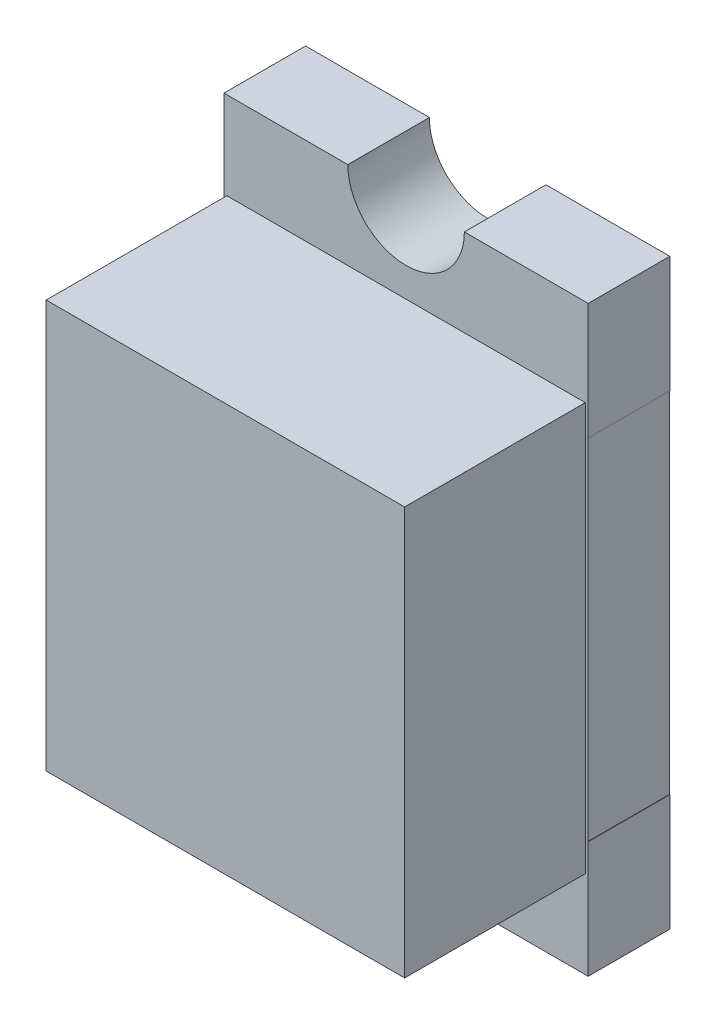
ISO-10303-21;
HEADER;
FILE_DESCRIPTION(('STEP AP214'),'2;1');
FILE_NAME('part.step','',(''),(''),'','','');
FILE_SCHEMA(('AUTOMOTIVE_DESIGN { 1 0 10303 214 1 1 1 1 }'));
ENDSEC;
DATA;
#1=APPLICATION_CONTEXT('core data for automotive mechanical design processes');
#2=APPLICATION_PROTOCOL_DEFINITION('international standard','automotive_design',2000,#1);
#3=PRODUCT_CONTEXT('',#1,'mechanical');
#4=PRODUCT('Part','Part','',(#3));
#5=PRODUCT_RELATED_PRODUCT_CATEGORY('part','',(#4));
#6=PRODUCT_DEFINITION_FORMATION('','',#4);
#7=PRODUCT_DEFINITION_CONTEXT('part definition',#1,'design');
#8=PRODUCT_DEFINITION('design','',#6,#7);
#9=PRODUCT_DEFINITION_SHAPE('','',#8);
#10=(LENGTH_UNIT() NAMED_UNIT(*) SI_UNIT(.MILLI.,.METRE.));
#11=(NAMED_UNIT(*) PLANE_ANGLE_UNIT() SI_UNIT($,.RADIAN.));
#12=(NAMED_UNIT(*) SI_UNIT($,.STERADIAN.) SOLID_ANGLE_UNIT());
#13=UNCERTAINTY_MEASURE_WITH_UNIT(LENGTH_MEASURE(1.E-05),#10,'distance_accuracy_value','');
#14=(GEOMETRIC_REPRESENTATION_CONTEXT(3) GLOBAL_UNCERTAINTY_ASSIGNED_CONTEXT((#13)) GLOBAL_UNIT_ASSIGNED_CONTEXT((#10,
#11,#12)) REPRESENTATION_CONTEXT('',''));
#15=CARTESIAN_POINT('',(0.,0.,0.));
#16=DIRECTION('',(0.,0.,1.));
#17=DIRECTION('',(1.,0.,0.));
#18=AXIS2_PLACEMENT_3D('',#15,#16,#17);
#19=CARTESIAN_POINT('',(0.010622111727652,0.0657002527691075,0.));
#20=DIRECTION('',(0.,0.,1.));
#21=DIRECTION('',(1.,0.,0.));
#22=AXIS2_PLACEMENT_3D('',#19,#20,#21);
#23=PLANE('',#22);
#24=CARTESIAN_POINT('',(0.0106221117276523,1.06570025276911,0.));
#25=DIRECTION('',(0.,0.,1.));
#26=DIRECTION('',(1.,0.,0.));
#27=AXIS2_PLACEMENT_3D('',#24,#25,#26);
#28=CIRCLE('',#27,0.2);
#29=CARTESIAN_POINT('',(-0.189377888272348,1.06570025276911,0.));
#30=VERTEX_POINT('',#29);
#31=CARTESIAN_POINT('',(0.210622111727652,1.06570025276911,0.));
#32=VERTEX_POINT('',#31);
#33=EDGE_CURVE('E20',#30,#32,#28,.T.);
#34=ORIENTED_EDGE('',*,*,#33,.T.);
#35=DIRECTION('',(1.,0.,0.));
#36=VECTOR('',#35,1.);
#37=CARTESIAN_POINT('',(0.635622111727652,1.06570025276911,0.));
#38=LINE('',#37,#36);
#39=CARTESIAN_POINT('',(0.635622111727652,1.06570025276911,0.));
#40=VERTEX_POINT('',#39);
#41=EDGE_CURVE('E178',#32,#40,#38,.T.);
#42=ORIENTED_EDGE('',*,*,#41,.T.);
#43=DIRECTION('',(0.,-1.,0.));
#44=VECTOR('',#43,1.);
#45=CARTESIAN_POINT('',(0.635622111727652,1.06570025276911,0.));
#46=LINE('',#45,#44);
#47=CARTESIAN_POINT('',(0.635622111727652,0.665700252769107,0.));
#48=VERTEX_POINT('',#47);
#49=EDGE_CURVE('E183',#40,#48,#46,.T.);
#50=ORIENTED_EDGE('',*,*,#49,.T.);
#51=DIRECTION('',(1.,0.,0.));
#52=VECTOR('',#51,1.);
#53=CARTESIAN_POINT('',(0.010622111727652,0.665700252769107,0.));
#54=LINE('',#53,#52);
#55=CARTESIAN_POINT('',(0.634622111727652,0.665700252769107,0.));
#56=VERTEX_POINT('',#55);
#57=EDGE_CURVE('E257',#48,#56,#54,.F.);
#58=ORIENTED_EDGE('',*,*,#57,.T.);
#59=DIRECTION('',(0.,-1.,0.));
#60=VECTOR('',#59,1.);
#61=CARTESIAN_POINT('',(0.634622111727652,-0.534299747230893,0.));
#62=LINE('',#61,#60);
#63=CARTESIAN_POINT('',(0.634622111727652,-0.534299747230893,0.));
#64=VERTEX_POINT('',#63);
#65=EDGE_CURVE('E189',#56,#64,#62,.T.);
#66=ORIENTED_EDGE('',*,*,#65,.T.);
#67=DIRECTION('',(1.,0.,0.));
#68=VECTOR('',#67,1.);
#69=CARTESIAN_POINT('',(0.010622111727652,-0.534299747230893,0.));
#70=LINE('',#69,#68);
#71=CARTESIAN_POINT('',(0.635622111727652,-0.534299747230893,0.));
#72=VERTEX_POINT('',#71);
#73=EDGE_CURVE('E198',#64,#72,#70,.T.);
#74=ORIENTED_EDGE('',*,*,#73,.T.);
#75=DIRECTION('',(0.,-1.,0.));
#76=VECTOR('',#75,1.);
#77=CARTESIAN_POINT('',(0.635622111727652,1.06570025276911,0.));
#78=LINE('',#77,#76);
#79=CARTESIAN_POINT('',(0.635622111727652,-0.934299747230893,0.));
#80=VERTEX_POINT('',#79);
#81=EDGE_CURVE('E195',#72,#80,#78,.T.);
#82=ORIENTED_EDGE('',*,*,#81,.T.);
#83=DIRECTION('',(-1.,0.,0.));
#84=VECTOR('',#83,1.);
#85=CARTESIAN_POINT('',(0.635622111727652,-0.934299747230893,0.));
#86=LINE('',#85,#84);
#87=CARTESIAN_POINT('',(0.210622111727652,-0.934299747230893,0.));
#88=VERTEX_POINT('',#87);
#89=EDGE_CURVE('E202',#80,#88,#86,.T.);
#90=ORIENTED_EDGE('',*,*,#89,.T.);
#91=CARTESIAN_POINT('',(0.0106221117276525,-0.934299747230892,0.));
#92=DIRECTION('',(0.,0.,1.));
#93=DIRECTION('',(1.,0.,0.));
#94=AXIS2_PLACEMENT_3D('',#91,#92,#93);
#95=CIRCLE('',#94,0.2);
#96=CARTESIAN_POINT('',(-0.189377888272347,-0.934299747230893,0.));
#97=VERTEX_POINT('',#96);
#98=EDGE_CURVE('E211',#88,#97,#95,.T.);
#99=ORIENTED_EDGE('',*,*,#98,.T.);
#100=DIRECTION('',(-1.,0.,0.));
#101=VECTOR('',#100,1.);
#102=CARTESIAN_POINT('',(0.635622111727652,-0.934299747230893,0.));
#103=LINE('',#102,#101);
#104=CARTESIAN_POINT('',(-0.614377888272348,-0.934299747230893,0.));
#105=VERTEX_POINT('',#104);
#106=EDGE_CURVE('E208',#97,#105,#103,.T.);
#107=ORIENTED_EDGE('',*,*,#106,.T.);
#108=DIRECTION('',(0.,1.,0.));
#109=VECTOR('',#108,1.);
#110=CARTESIAN_POINT('',(-0.614377888272348,1.06570025276911,0.));
#111=LINE('',#110,#109);
#112=CARTESIAN_POINT('',(-0.614377888272348,-0.534299747230892,0.));
#113=VERTEX_POINT('',#112);
#114=EDGE_CURVE('E215',#105,#113,#111,.T.);
#115=ORIENTED_EDGE('',*,*,#114,.T.);
#116=DIRECTION('',(1.,0.,0.));
#117=VECTOR('',#116,1.);
#118=CARTESIAN_POINT('',(0.010622111727652,-0.534299747230892,0.));
#119=LINE('',#118,#117);
#120=CARTESIAN_POINT('',(-0.613377888272348,-0.534299747230892,0.));
#121=VERTEX_POINT('',#120);
#122=EDGE_CURVE('E262',#113,#121,#119,.T.);
#123=ORIENTED_EDGE('',*,*,#122,.T.);
#124=DIRECTION('',(0.,1.,0.));
#125=VECTOR('',#124,1.);
#126=CARTESIAN_POINT('',(-0.613377888272348,-0.534299747230892,0.));
#127=LINE('',#126,#125);
#128=CARTESIAN_POINT('',(-0.613377888272348,0.665700252769108,0.));
#129=VERTEX_POINT('',#128);
#130=EDGE_CURVE('E221',#121,#129,#127,.T.);
#131=ORIENTED_EDGE('',*,*,#130,.T.);
#132=DIRECTION('',(1.,0.,0.));
#133=VECTOR('',#132,1.);
#134=CARTESIAN_POINT('',(0.010622111727652,0.665700252769108,0.));
#135=LINE('',#134,#133);
#136=CARTESIAN_POINT('',(-0.614377888272348,0.665700252769108,0.));
#137=VERTEX_POINT('',#136);
#138=EDGE_CURVE('E228',#129,#137,#135,.F.);
#139=ORIENTED_EDGE('',*,*,#138,.T.);
#140=DIRECTION('',(0.,1.,0.));
#141=VECTOR('',#140,1.);
#142=CARTESIAN_POINT('',(-0.614377888272348,1.06570025276911,0.));
#143=LINE('',#142,#141);
#144=CARTESIAN_POINT('',(-0.614377888272348,1.06570025276911,0.));
#145=VERTEX_POINT('',#144);
#146=EDGE_CURVE('E156',#137,#145,#143,.T.);
#147=ORIENTED_EDGE('',*,*,#146,.T.);
#148=DIRECTION('',(1.,0.,0.));
#149=VECTOR('',#148,1.);
#150=CARTESIAN_POINT('',(0.635622111727652,1.06570025276911,0.));
#151=LINE('',#150,#149);
#152=EDGE_CURVE('E151',#145,#30,#151,.T.);
#153=ORIENTED_EDGE('',*,*,#152,.T.);
#154=EDGE_LOOP('',(#34,#42,#50,#58,#66,#74,#82,#90,#99,#107,#115,#123,#131,#139,#147,#153));
#155=FACE_BOUND('',#154,.T.);
#156=ADVANCED_FACE('F17',(#155),#23,.F.);
#157=CARTESIAN_POINT('',(0.0106221117276523,1.06570025276911,0.));
#158=DIRECTION('',(0.,0.,1.));
#159=DIRECTION('',(1.,0.,0.));
#160=AXIS2_PLACEMENT_3D('',#157,#158,#159);
#161=CYLINDRICAL_SURFACE('',#160,0.2);
#162=ORIENTED_EDGE('',*,*,#33,.F.);
#163=DIRECTION('',(0.,0.,1.));
#164=VECTOR('',#163,1.);
#165=CARTESIAN_POINT('',(-0.189377888272348,1.06570025276911,0.9));
#166=LINE('',#165,#164);
#167=CARTESIAN_POINT('',(-0.189377888272348,1.06570025276911,0.28));
#168=VERTEX_POINT('',#167);
#169=EDGE_CURVE('E160',#30,#168,#166,.T.);
#170=ORIENTED_EDGE('',*,*,#169,.T.);
#171=CARTESIAN_POINT('',(0.0106221117276523,1.06570025276911,0.28));
#172=DIRECTION('',(0.,0.,1.));
#173=DIRECTION('',(1.,0.,0.));
#174=AXIS2_PLACEMENT_3D('',#171,#172,#173);
#175=CIRCLE('',#174,0.2);
#176=CARTESIAN_POINT('',(0.210622111727652,1.06570025276911,0.28));
#177=VERTEX_POINT('',#176);
#178=EDGE_CURVE('E180',#177,#168,#175,.F.);
#179=ORIENTED_EDGE('',*,*,#178,.F.);
#180=DIRECTION('',(0.,0.,1.));
#181=VECTOR('',#180,1.);
#182=CARTESIAN_POINT('',(0.210622111727652,1.06570025276911,0.9));
#183=LINE('',#182,#181);
#184=EDGE_CURVE('E166',#177,#32,#183,.F.);
#185=ORIENTED_EDGE('',*,*,#184,.T.);
#186=EDGE_LOOP('',(#162,#170,#179,#185));
#187=FACE_BOUND('',#186,.T.);
#188=ADVANCED_FACE('F163',(#187),#161,.F.);
#189=CARTESIAN_POINT('',(0.635622111727652,1.06570025276911,0.9));
#190=DIRECTION('',(0.,-1.,0.));
#191=DIRECTION('',(1.,0.,0.));
#192=AXIS2_PLACEMENT_3D('',#189,#190,#191);
#193=PLANE('',#192);
#194=ORIENTED_EDGE('',*,*,#169,.F.);
#195=ORIENTED_EDGE('',*,*,#152,.F.);
#196=DIRECTION('',(0.,0.,1.));
#197=VECTOR('',#196,1.);
#198=CARTESIAN_POINT('',(-0.614377888272348,1.06570025276911,0.9));
#199=LINE('',#198,#197);
#200=CARTESIAN_POINT('',(-0.614377888272348,1.06570025276911,0.28));
#201=VERTEX_POINT('',#200);
#202=EDGE_CURVE('E172',#145,#201,#199,.T.);
#203=ORIENTED_EDGE('',*,*,#202,.T.);
#204=DIRECTION('',(1.,0.,0.));
#205=VECTOR('',#204,1.);
#206=CARTESIAN_POINT('',(0.010622111727652,1.06570025276911,0.28));
#207=LINE('',#206,#205);
#208=EDGE_CURVE('E170',#168,#201,#207,.F.);
#209=ORIENTED_EDGE('',*,*,#208,.F.);
#210=EDGE_LOOP('',(#194,#195,#203,#209));
#211=FACE_BOUND('',#210,.T.);
#212=ADVANCED_FACE('F168',(#211),#193,.F.);
#213=CARTESIAN_POINT('',(-0.614377888272348,1.06570025276911,0.9));
#214=DIRECTION('',(1.,0.,0.));
#215=DIRECTION('',(0.,1.,0.));
#216=AXIS2_PLACEMENT_3D('',#213,#214,#215);
#217=PLANE('',#216);
#218=DIRECTION('',(0.,0.,1.));
#219=VECTOR('',#218,1.);
#220=CARTESIAN_POINT('',(-0.614377888272348,0.665700252769108,1.480000416667));
#221=LINE('',#220,#219);
#222=CARTESIAN_POINT('',(-0.614377888272348,0.665700252769108,0.28));
#223=VERTEX_POINT('',#222);
#224=EDGE_CURVE('E224',#137,#223,#221,.T.);
#225=ORIENTED_EDGE('',*,*,#224,.T.);
#226=DIRECTION('',(0.,1.,0.));
#227=VECTOR('',#226,1.);
#228=CARTESIAN_POINT('',(-0.614377888272348,0.0657002527691075,0.28));
#229=LINE('',#228,#227);
#230=EDGE_CURVE('E255',#201,#223,#229,.F.);
#231=ORIENTED_EDGE('',*,*,#230,.F.);
#232=ORIENTED_EDGE('',*,*,#202,.F.);
#233=ORIENTED_EDGE('',*,*,#146,.F.);
#234=EDGE_LOOP('',(#225,#231,#232,#233));
#235=FACE_BOUND('',#234,.T.);
#236=ADVANCED_FACE('F565',(#235),#217,.F.);
#237=CARTESIAN_POINT('',(-0.613377888272348,0.665700252769108,1.480000416667));
#238=DIRECTION('',(0.,1.,0.));
#239=DIRECTION('',(-1.,0.,0.));
#240=AXIS2_PLACEMENT_3D('',#237,#238,#239);
#241=PLANE('',#240);
#242=ORIENTED_EDGE('',*,*,#138,.F.);
#243=DIRECTION('',(0.,0.,1.));
#244=VECTOR('',#243,1.);
#245=CARTESIAN_POINT('',(-0.613377888272348,0.665700252769108,1.480000416667));
#246=LINE('',#245,#244);
#247=CARTESIAN_POINT('',(-0.613377888272348,0.665700252769108,0.28));
#248=VERTEX_POINT('',#247);
#249=EDGE_CURVE('E223',#129,#248,#246,.T.);
#250=ORIENTED_EDGE('',*,*,#249,.T.);
#251=DIRECTION('',(1.,0.,0.));
#252=VECTOR('',#251,1.);
#253=CARTESIAN_POINT('',(0.010622111727652,0.665700252769108,0.28));
#254=LINE('',#253,#252);
#255=EDGE_CURVE('E252',#223,#248,#254,.T.);
#256=ORIENTED_EDGE('',*,*,#255,.F.);
#257=ORIENTED_EDGE('',*,*,#224,.F.);
#258=EDGE_LOOP('',(#242,#250,#256,#257));
#259=FACE_BOUND('',#258,.T.);
#260=ADVANCED_FACE('F431',(#259),#241,.F.);
#261=CARTESIAN_POINT('',(-0.613377888272348,-0.534299747230892,1.480000416667));
#262=DIRECTION('',(1.,0.,0.));
#263=DIRECTION('',(0.,1.,0.));
#264=AXIS2_PLACEMENT_3D('',#261,#262,#263);
#265=PLANE('',#264);
#266=ORIENTED_EDGE('',*,*,#130,.F.);
#267=DIRECTION('',(0.,0.,1.));
#268=VECTOR('',#267,1.);
#269=CARTESIAN_POINT('',(-0.613377888272348,-0.534299747230892,1.480000416667));
#270=LINE('',#269,#268);
#271=CARTESIAN_POINT('',(-0.613377888272348,-0.534299747230892,0.28));
#272=VERTEX_POINT('',#271);
#273=EDGE_CURVE('E218',#121,#272,#270,.T.);
#274=ORIENTED_EDGE('',*,*,#273,.T.);
#275=DIRECTION('',(0.,1.,0.));
#276=VECTOR('',#275,1.);
#277=CARTESIAN_POINT('',(-0.613377888272348,0.0657002527691075,0.28));
#278=LINE('',#277,#276);
#279=EDGE_CURVE('E251',#248,#272,#278,.F.);
#280=ORIENTED_EDGE('',*,*,#279,.F.);
#281=ORIENTED_EDGE('',*,*,#249,.F.);
#282=EDGE_LOOP('',(#266,#274,#280,#281));
#283=FACE_BOUND('',#282,.T.);
#284=ADVANCED_FACE('F424',(#283),#265,.F.);
#285=CARTESIAN_POINT('',(-0.613377888272348,-0.534299747230892,1.480000416667));
#286=DIRECTION('',(0.,-1.,0.));
#287=DIRECTION('',(1.,0.,0.));
#288=AXIS2_PLACEMENT_3D('',#285,#286,#287);
#289=PLANE('',#288);
#290=ORIENTED_EDGE('',*,*,#122,.F.);
#291=DIRECTION('',(0.,0.,1.));
#292=VECTOR('',#291,1.);
#293=CARTESIAN_POINT('',(-0.614377888272348,-0.534299747230892,0.9));
#294=LINE('',#293,#292);
#295=CARTESIAN_POINT('',(-0.614377888272348,-0.534299747230892,0.28));
#296=VERTEX_POINT('',#295);
#297=EDGE_CURVE('E217',#113,#296,#294,.T.);
#298=ORIENTED_EDGE('',*,*,#297,.T.);
#299=DIRECTION('',(1.,0.,0.));
#300=VECTOR('',#299,1.);
#301=CARTESIAN_POINT('',(0.010622111727652,-0.534299747230892,0.28));
#302=LINE('',#301,#300);
#303=EDGE_CURVE('E247',#272,#296,#302,.F.);
#304=ORIENTED_EDGE('',*,*,#303,.F.);
#305=ORIENTED_EDGE('',*,*,#273,.F.);
#306=EDGE_LOOP('',(#290,#298,#304,#305));
#307=FACE_BOUND('',#306,.T.);
#308=ADVANCED_FACE('F430',(#307),#289,.F.);
#309=CARTESIAN_POINT('',(-0.614377888272348,1.06570025276911,0.9));
#310=DIRECTION('',(1.,0.,0.));
#311=DIRECTION('',(0.,1.,0.));
#312=AXIS2_PLACEMENT_3D('',#309,#310,#311);
#313=PLANE('',#312);
#314=ORIENTED_EDGE('',*,*,#297,.F.);
#315=ORIENTED_EDGE('',*,*,#114,.F.);
#316=DIRECTION('',(0.,0.,1.));
#317=VECTOR('',#316,1.);
#318=CARTESIAN_POINT('',(-0.614377888272348,-0.934299747230893,0.9));
#319=LINE('',#318,#317);
#320=CARTESIAN_POINT('',(-0.614377888272348,-0.934299747230892,0.28));
#321=VERTEX_POINT('',#320);
#322=EDGE_CURVE('E212',#105,#321,#319,.T.);
#323=ORIENTED_EDGE('',*,*,#322,.T.);
#324=DIRECTION('',(0.,1.,0.));
#325=VECTOR('',#324,1.);
#326=CARTESIAN_POINT('',(-0.614377888272348,0.0657002527691075,0.28));
#327=LINE('',#326,#325);
#328=EDGE_CURVE('E250',#296,#321,#327,.F.);
#329=ORIENTED_EDGE('',*,*,#328,.F.);
#330=EDGE_LOOP('',(#314,#315,#323,#329));
#331=FACE_BOUND('',#330,.T.);
#332=ADVANCED_FACE('F448',(#331),#313,.F.);
#333=CARTESIAN_POINT('',(0.635622111727652,-0.934299747230893,0.9));
#334=DIRECTION('',(0.,1.,0.));
#335=DIRECTION('',(-1.,0.,0.));
#336=AXIS2_PLACEMENT_3D('',#333,#334,#335);
#337=PLANE('',#336);
#338=DIRECTION('',(0.,0.,1.));
#339=VECTOR('',#338,1.);
#340=CARTESIAN_POINT('',(-0.189377888272347,-0.934299747230892,0.));
#341=LINE('',#340,#339);
#342=CARTESIAN_POINT('',(-0.189377888272347,-0.934299747230892,0.28));
#343=VERTEX_POINT('',#342);
#344=EDGE_CURVE('E205',#97,#343,#341,.T.);
#345=ORIENTED_EDGE('',*,*,#344,.T.);
#346=DIRECTION('',(1.,0.,0.));
#347=VECTOR('',#346,1.);
#348=CARTESIAN_POINT('',(0.010622111727652,-0.934299747230892,0.28));
#349=LINE('',#348,#347);
#350=EDGE_CURVE('E246',#321,#343,#349,.T.);
#351=ORIENTED_EDGE('',*,*,#350,.F.);
#352=ORIENTED_EDGE('',*,*,#322,.F.);
#353=ORIENTED_EDGE('',*,*,#106,.F.);
#354=EDGE_LOOP('',(#345,#351,#352,#353));
#355=FACE_BOUND('',#354,.T.);
#356=ADVANCED_FACE('F441',(#355),#337,.F.);
#357=CARTESIAN_POINT('',(0.0106221117276525,-0.934299747230892,0.));
#358=DIRECTION('',(0.,0.,1.));
#359=DIRECTION('',(1.,0.,0.));
#360=AXIS2_PLACEMENT_3D('',#357,#358,#359);
#361=CYLINDRICAL_SURFACE('',#360,0.2);
#362=CARTESIAN_POINT('',(0.0106221117276525,-0.934299747230892,0.28));
#363=DIRECTION('',(0.,0.,1.));
#364=DIRECTION('',(1.,0.,0.));
#365=AXIS2_PLACEMENT_3D('',#362,#363,#364);
#366=CIRCLE('',#365,0.2);
#367=CARTESIAN_POINT('',(0.210622111727652,-0.934299747230893,0.28));
#368=VERTEX_POINT('',#367);
#369=EDGE_CURVE('E242',#343,#368,#366,.F.);
#370=ORIENTED_EDGE('',*,*,#369,.F.);
#371=ORIENTED_EDGE('',*,*,#344,.F.);
#372=ORIENTED_EDGE('',*,*,#98,.F.);
#373=DIRECTION('',(0.,0.,1.));
#374=VECTOR('',#373,1.);
#375=CARTESIAN_POINT('',(0.210622111727652,-0.934299747230893,0.9));
#376=LINE('',#375,#374);
#377=EDGE_CURVE('E204',#88,#368,#376,.T.);
#378=ORIENTED_EDGE('',*,*,#377,.T.);
#379=EDGE_LOOP('',(#370,#371,#372,#378));
#380=FACE_BOUND('',#379,.T.);
#381=ADVANCED_FACE('F447',(#380),#361,.F.);
#382=CARTESIAN_POINT('',(0.635622111727652,-0.934299747230893,0.9));
#383=DIRECTION('',(0.,1.,0.));
#384=DIRECTION('',(-1.,0.,0.));
#385=AXIS2_PLACEMENT_3D('',#382,#383,#384);
#386=PLANE('',#385);
#387=ORIENTED_EDGE('',*,*,#377,.F.);
#388=ORIENTED_EDGE('',*,*,#89,.F.);
#389=DIRECTION('',(0.,0.,1.));
#390=VECTOR('',#389,1.);
#391=CARTESIAN_POINT('',(0.635622111727652,-0.934299747230893,0.9));
#392=LINE('',#391,#390);
#393=CARTESIAN_POINT('',(0.635622111727652,-0.934299747230892,0.28));
#394=VERTEX_POINT('',#393);
#395=EDGE_CURVE('E199',#80,#394,#392,.T.);
#396=ORIENTED_EDGE('',*,*,#395,.T.);
#397=DIRECTION('',(1.,0.,0.));
#398=VECTOR('',#397,1.);
#399=CARTESIAN_POINT('',(0.010622111727652,-0.934299747230892,0.28));
#400=LINE('',#399,#398);
#401=EDGE_CURVE('E245',#368,#394,#400,.T.);
#402=ORIENTED_EDGE('',*,*,#401,.F.);
#403=EDGE_LOOP('',(#387,#388,#396,#402));
#404=FACE_BOUND('',#403,.T.);
#405=ADVANCED_FACE('F520',(#404),#386,.F.);
#406=CARTESIAN_POINT('',(0.635622111727652,1.06570025276911,0.9));
#407=DIRECTION('',(-1.,0.,0.));
#408=DIRECTION('',(0.,-1.,0.));
#409=AXIS2_PLACEMENT_3D('',#406,#407,#408);
#410=PLANE('',#409);
#411=DIRECTION('',(0.,0.,1.));
#412=VECTOR('',#411,1.);
#413=CARTESIAN_POINT('',(0.635622111727652,-0.534299747230893,1.480000416667));
#414=LINE('',#413,#412);
#415=CARTESIAN_POINT('',(0.635622111727652,-0.534299747230893,0.28));
#416=VERTEX_POINT('',#415);
#417=EDGE_CURVE('E192',#72,#416,#414,.T.);
#418=ORIENTED_EDGE('',*,*,#417,.T.);
#419=DIRECTION('',(0.,1.,0.));
#420=VECTOR('',#419,1.);
#421=CARTESIAN_POINT('',(0.635622111727652,0.0657002527691075,0.28));
#422=LINE('',#421,#420);
#423=EDGE_CURVE('E241',#394,#416,#422,.T.);
#424=ORIENTED_EDGE('',*,*,#423,.F.);
#425=ORIENTED_EDGE('',*,*,#395,.F.);
#426=ORIENTED_EDGE('',*,*,#81,.F.);
#427=EDGE_LOOP('',(#418,#424,#425,#426));
#428=FACE_BOUND('',#427,.T.);
#429=ADVANCED_FACE('F547',(#428),#410,.F.);
#430=CARTESIAN_POINT('',(0.635622111727652,-0.534299747230893,1.480000416667));
#431=DIRECTION('',(0.,-1.,0.));
#432=DIRECTION('',(1.,0.,0.));
#433=AXIS2_PLACEMENT_3D('',#430,#431,#432);
#434=PLANE('',#433);
#435=ORIENTED_EDGE('',*,*,#73,.F.);
#436=DIRECTION('',(0.,0.,1.));
#437=VECTOR('',#436,1.);
#438=CARTESIAN_POINT('',(0.634622111727652,-0.534299747230893,1.480000416667));
#439=LINE('',#438,#437);
#440=CARTESIAN_POINT('',(0.634622111727652,-0.534299747230893,0.28));
#441=VERTEX_POINT('',#440);
#442=EDGE_CURVE('E191',#64,#441,#439,.T.);
#443=ORIENTED_EDGE('',*,*,#442,.T.);
#444=DIRECTION('',(1.,0.,0.));
#445=VECTOR('',#444,1.);
#446=CARTESIAN_POINT('',(0.010622111727652,-0.534299747230893,0.28));
#447=LINE('',#446,#445);
#448=EDGE_CURVE('E238',#416,#441,#447,.F.);
#449=ORIENTED_EDGE('',*,*,#448,.F.);
#450=ORIENTED_EDGE('',*,*,#417,.F.);
#451=EDGE_LOOP('',(#435,#443,#449,#450));
#452=FACE_BOUND('',#451,.T.);
#453=ADVANCED_FACE('F465',(#452),#434,.F.);
#454=CARTESIAN_POINT('',(0.634622111727652,-0.534299747230893,1.480000416667));
#455=DIRECTION('',(-1.,0.,0.));
#456=DIRECTION('',(0.,-1.,0.));
#457=AXIS2_PLACEMENT_3D('',#454,#455,#456);
#458=PLANE('',#457);
#459=ORIENTED_EDGE('',*,*,#65,.F.);
#460=DIRECTION('',(0.,0.,1.));
#461=VECTOR('',#460,1.);
#462=CARTESIAN_POINT('',(0.634622111727652,0.665700252769107,1.480000416667));
#463=LINE('',#462,#461);
#464=CARTESIAN_POINT('',(0.634622111727652,0.665700252769107,0.28));
#465=VERTEX_POINT('',#464);
#466=EDGE_CURVE('E186',#56,#465,#463,.T.);
#467=ORIENTED_EDGE('',*,*,#466,.T.);
#468=DIRECTION('',(0.,1.,0.));
#469=VECTOR('',#468,1.);
#470=CARTESIAN_POINT('',(0.634622111727652,0.0657002527691075,0.28));
#471=LINE('',#470,#469);
#472=EDGE_CURVE('E237',#441,#465,#471,.T.);
#473=ORIENTED_EDGE('',*,*,#472,.F.);
#474=ORIENTED_EDGE('',*,*,#442,.F.);
#475=EDGE_LOOP('',(#459,#467,#473,#474));
#476=FACE_BOUND('',#475,.T.);
#477=ADVANCED_FACE('F458',(#476),#458,.F.);
#478=CARTESIAN_POINT('',(0.635622111727652,0.665700252769107,1.480000416667));
#479=DIRECTION('',(0.,1.,0.));
#480=DIRECTION('',(-1.,0.,0.));
#481=AXIS2_PLACEMENT_3D('',#478,#479,#480);
#482=PLANE('',#481);
#483=ORIENTED_EDGE('',*,*,#57,.F.);
#484=DIRECTION('',(0.,0.,1.));
#485=VECTOR('',#484,1.);
#486=CARTESIAN_POINT('',(0.635622111727652,0.665700252769107,0.9));
#487=LINE('',#486,#485);
#488=CARTESIAN_POINT('',(0.635622111727652,0.665700252769107,0.28));
#489=VERTEX_POINT('',#488);
#490=EDGE_CURVE('E185',#48,#489,#487,.T.);
#491=ORIENTED_EDGE('',*,*,#490,.T.);
#492=DIRECTION('',(1.,0.,0.));
#493=VECTOR('',#492,1.);
#494=CARTESIAN_POINT('',(0.010622111727652,0.665700252769107,0.28));
#495=LINE('',#494,#493);
#496=EDGE_CURVE('E233',#465,#489,#495,.T.);
#497=ORIENTED_EDGE('',*,*,#496,.F.);
#498=ORIENTED_EDGE('',*,*,#466,.F.);
#499=EDGE_LOOP('',(#483,#491,#497,#498));
#500=FACE_BOUND('',#499,.T.);
#501=ADVANCED_FACE('F464',(#500),#482,.F.);
#502=CARTESIAN_POINT('',(0.635622111727652,1.06570025276911,0.9));
#503=DIRECTION('',(-1.,0.,0.));
#504=DIRECTION('',(0.,-1.,0.));
#505=AXIS2_PLACEMENT_3D('',#502,#503,#504);
#506=PLANE('',#505);
#507=ORIENTED_EDGE('',*,*,#490,.F.);
#508=ORIENTED_EDGE('',*,*,#49,.F.);
#509=DIRECTION('',(0.,0.,1.));
#510=VECTOR('',#509,1.);
#511=CARTESIAN_POINT('',(0.635622111727652,1.06570025276911,0.9));
#512=LINE('',#511,#510);
#513=CARTESIAN_POINT('',(0.635622111727652,1.06570025276911,0.28));
#514=VERTEX_POINT('',#513);
#515=EDGE_CURVE('E286',#40,#514,#512,.T.);
#516=ORIENTED_EDGE('',*,*,#515,.T.);
#517=DIRECTION('',(0.,1.,0.));
#518=VECTOR('',#517,1.);
#519=CARTESIAN_POINT('',(0.635622111727652,0.0657002527691075,0.28));
#520=LINE('',#519,#518);
#521=EDGE_CURVE('E236',#489,#514,#520,.T.);
#522=ORIENTED_EDGE('',*,*,#521,.F.);
#523=EDGE_LOOP('',(#507,#508,#516,#522));
#524=FACE_BOUND('',#523,.T.);
#525=ADVANCED_FACE('F479',(#524),#506,.F.);
#526=CARTESIAN_POINT('',(0.635622111727652,1.06570025276911,0.9));
#527=DIRECTION('',(0.,-1.,0.));
#528=DIRECTION('',(1.,0.,0.));
#529=AXIS2_PLACEMENT_3D('',#526,#527,#528);
#530=PLANE('',#529);
#531=ORIENTED_EDGE('',*,*,#184,.F.);
#532=DIRECTION('',(1.,0.,0.));
#533=VECTOR('',#532,1.);
#534=CARTESIAN_POINT('',(0.010622111727652,1.06570025276911,0.28));
#535=LINE('',#534,#533);
#536=EDGE_CURVE('E322',#514,#177,#535,.F.);
#537=ORIENTED_EDGE('',*,*,#536,.F.);
#538=ORIENTED_EDGE('',*,*,#515,.F.);
#539=ORIENTED_EDGE('',*,*,#41,.F.);
#540=EDGE_LOOP('',(#531,#537,#538,#539));
#541=FACE_BOUND('',#540,.T.);
#542=ADVANCED_FACE('F378',(#541),#530,.F.);
#543=CARTESIAN_POINT('',(0.010622111727652,0.0657002527691075,0.28));
#544=DIRECTION('',(0.,0.,1.));
#545=DIRECTION('',(1.,0.,0.));
#546=AXIS2_PLACEMENT_3D('',#543,#544,#545);
#547=PLANE('',#546);
#548=DIRECTION('',(0.,1.,0.));
#549=VECTOR('',#548,1.);
#550=CARTESIAN_POINT('',(-0.604377888272348,0.765700252769108,0.28));
#551=LINE('',#550,#549);
#552=CARTESIAN_POINT('',(-0.604377888272348,-0.634299747230892,0.28));
#553=VERTEX_POINT('',#552);
#554=CARTESIAN_POINT('',(-0.604377888272348,0.765700252769108,0.28));
#555=VERTEX_POINT('',#554);
#556=EDGE_CURVE('E336',#553,#555,#551,.T.);
#557=ORIENTED_EDGE('',*,*,#556,.T.);
#558=DIRECTION('',(1.,0.,0.));
#559=VECTOR('',#558,1.);
#560=CARTESIAN_POINT('',(-0.604377888272348,0.765700252769108,0.28));
#561=LINE('',#560,#559);
#562=CARTESIAN_POINT('',(0.625622111727652,0.765700252769108,0.28));
#563=VERTEX_POINT('',#562);
#564=EDGE_CURVE('E331',#555,#563,#561,.T.);
#565=ORIENTED_EDGE('',*,*,#564,.T.);
#566=DIRECTION('',(0.,-1.,0.));
#567=VECTOR('',#566,1.);
#568=CARTESIAN_POINT('',(0.625622111727652,-0.634299747230893,0.28));
#569=LINE('',#568,#567);
#570=CARTESIAN_POINT('',(0.625622111727652,-0.634299747230893,0.28));
#571=VERTEX_POINT('',#570);
#572=EDGE_CURVE('E327',#563,#571,#569,.T.);
#573=ORIENTED_EDGE('',*,*,#572,.T.);
#574=DIRECTION('',(-1.,0.,0.));
#575=VECTOR('',#574,1.);
#576=CARTESIAN_POINT('',(0.625622111727652,-0.634299747230893,0.28));
#577=LINE('',#576,#575);
#578=EDGE_CURVE('E343',#571,#553,#577,.T.);
#579=ORIENTED_EDGE('',*,*,#578,.T.);
#580=EDGE_LOOP('',(#557,#565,#573,#579));
#581=FACE_BOUND('',#580,.T.);
#582=ORIENTED_EDGE('',*,*,#521,.T.);
#583=ORIENTED_EDGE('',*,*,#536,.T.);
#584=ORIENTED_EDGE('',*,*,#178,.T.);
#585=ORIENTED_EDGE('',*,*,#208,.T.);
#586=ORIENTED_EDGE('',*,*,#230,.T.);
#587=ORIENTED_EDGE('',*,*,#255,.T.);
#588=ORIENTED_EDGE('',*,*,#279,.T.);
#589=ORIENTED_EDGE('',*,*,#303,.T.);
#590=ORIENTED_EDGE('',*,*,#328,.T.);
#591=ORIENTED_EDGE('',*,*,#350,.T.);
#592=ORIENTED_EDGE('',*,*,#369,.T.);
#593=ORIENTED_EDGE('',*,*,#401,.T.);
#594=ORIENTED_EDGE('',*,*,#423,.T.);
#595=ORIENTED_EDGE('',*,*,#448,.T.);
#596=ORIENTED_EDGE('',*,*,#472,.T.);
#597=ORIENTED_EDGE('',*,*,#496,.T.);
#598=EDGE_LOOP('',(#582,#583,#584,#585,#586,#587,#588,#589,#590,#591,#592,#593,#594,#595,#596,#597));
#599=FACE_BOUND('',#598,.T.);
#600=ADVANCED_FACE('F362',(#581,#599),#547,.T.);
#601=CARTESIAN_POINT('',(0.625622111727652,-0.634299747230893,0.9));
#602=DIRECTION('',(-1.,0.,0.));
#603=DIRECTION('',(0.,-1.,0.));
#604=AXIS2_PLACEMENT_3D('',#601,#602,#603);
#605=PLANE('',#604);
#606=DIRECTION('',(0.,0.,1.));
#607=VECTOR('',#606,1.);
#608=CARTESIAN_POINT('',(0.625622111727652,0.765700252769108,0.9));
#609=LINE('',#608,#607);
#610=CARTESIAN_POINT('',(0.625622111727652,0.765700252769107,0.9));
#611=VERTEX_POINT('',#610);
#612=EDGE_CURVE('E329',#563,#611,#609,.T.);
#613=ORIENTED_EDGE('',*,*,#612,.T.);
#614=DIRECTION('',(0.,1.,0.));
#615=VECTOR('',#614,1.);
#616=CARTESIAN_POINT('',(0.625622111727652,0.0657002527691075,0.9));
#617=LINE('',#616,#615);
#618=CARTESIAN_POINT('',(0.625622111727652,-0.634299747230893,0.9));
#619=VERTEX_POINT('',#618);
#620=EDGE_CURVE('E346',#619,#611,#617,.T.);
#621=ORIENTED_EDGE('',*,*,#620,.F.);
#622=DIRECTION('',(0.,0.,1.));
#623=VECTOR('',#622,1.);
#624=CARTESIAN_POINT('',(0.625622111727652,-0.634299747230893,0.9));
#625=LINE('',#624,#623);
#626=EDGE_CURVE('E340',#619,#571,#625,.F.);
#627=ORIENTED_EDGE('',*,*,#626,.T.);
#628=ORIENTED_EDGE('',*,*,#572,.F.);
#629=EDGE_LOOP('',(#613,#621,#627,#628));
#630=FACE_BOUND('',#629,.T.);
#631=ADVANCED_FACE('F369',(#630),#605,.F.);
#632=CARTESIAN_POINT('',(-0.604377888272348,0.765700252769108,0.9));
#633=DIRECTION('',(0.,-1.,0.));
#634=DIRECTION('',(1.,0.,0.));
#635=AXIS2_PLACEMENT_3D('',#632,#633,#634);
#636=PLANE('',#635);
#637=DIRECTION('',(0.,0.,1.));
#638=VECTOR('',#637,1.);
#639=CARTESIAN_POINT('',(-0.604377888272348,0.765700252769108,0.9));
#640=LINE('',#639,#638);
#641=CARTESIAN_POINT('',(-0.604377888272348,0.765700252769108,0.9));
#642=VERTEX_POINT('',#641);
#643=EDGE_CURVE('E334',#555,#642,#640,.T.);
#644=ORIENTED_EDGE('',*,*,#643,.T.);
#645=DIRECTION('',(1.,0.,0.));
#646=VECTOR('',#645,1.);
#647=CARTESIAN_POINT('',(0.010622111727652,0.765700252769107,0.9));
#648=LINE('',#647,#646);
#649=EDGE_CURVE('E349',#611,#642,#648,.F.);
#650=ORIENTED_EDGE('',*,*,#649,.F.);
#651=ORIENTED_EDGE('',*,*,#612,.F.);
#652=ORIENTED_EDGE('',*,*,#564,.F.);
#653=EDGE_LOOP('',(#644,#650,#651,#652));
#654=FACE_BOUND('',#653,.T.);
#655=ADVANCED_FACE('F359',(#654),#636,.F.);
#656=CARTESIAN_POINT('',(-0.604377888272348,0.765700252769108,0.9));
#657=DIRECTION('',(1.,0.,0.));
#658=DIRECTION('',(0.,1.,0.));
#659=AXIS2_PLACEMENT_3D('',#656,#657,#658);
#660=PLANE('',#659);
#661=DIRECTION('',(0.,0.,1.));
#662=VECTOR('',#661,1.);
#663=CARTESIAN_POINT('',(-0.604377888272348,-0.634299747230893,0.9));
#664=LINE('',#663,#662);
#665=CARTESIAN_POINT('',(-0.604377888272348,-0.634299747230892,0.9));
#666=VERTEX_POINT('',#665);
#667=EDGE_CURVE('E35',#553,#666,#664,.T.);
#668=ORIENTED_EDGE('',*,*,#667,.T.);
#669=DIRECTION('',(0.,1.,0.));
#670=VECTOR('',#669,1.);
#671=CARTESIAN_POINT('',(-0.604377888272348,0.0657002527691075,0.9));
#672=LINE('',#671,#670);
#673=EDGE_CURVE('E26',#642,#666,#672,.F.);
#674=ORIENTED_EDGE('',*,*,#673,.F.);
#675=ORIENTED_EDGE('',*,*,#643,.F.);
#676=ORIENTED_EDGE('',*,*,#556,.F.);
#677=EDGE_LOOP('',(#668,#674,#675,#676));
#678=FACE_BOUND('',#677,.T.);
#679=ADVANCED_FACE('F357',(#678),#660,.F.);
#680=CARTESIAN_POINT('',(0.625622111727652,-0.634299747230893,0.9));
#681=DIRECTION('',(0.,1.,0.));
#682=DIRECTION('',(-1.,0.,0.));
#683=AXIS2_PLACEMENT_3D('',#680,#681,#682);
#684=PLANE('',#683);
#685=ORIENTED_EDGE('',*,*,#626,.F.);
#686=DIRECTION('',(1.,0.,0.));
#687=VECTOR('',#686,1.);
#688=CARTESIAN_POINT('',(0.010622111727652,-0.634299747230892,0.9));
#689=LINE('',#688,#687);
#690=EDGE_CURVE('E11',#666,#619,#689,.T.);
#691=ORIENTED_EDGE('',*,*,#690,.F.);
#692=ORIENTED_EDGE('',*,*,#667,.F.);
#693=ORIENTED_EDGE('',*,*,#578,.F.);
#694=EDGE_LOOP('',(#685,#691,#692,#693));
#695=FACE_BOUND('',#694,.T.);
#696=ADVANCED_FACE('F367',(#695),#684,.F.);
#697=CARTESIAN_POINT('',(0.010622111727652,0.0657002527691075,0.9));
#698=DIRECTION('',(0.,0.,1.));
#699=DIRECTION('',(1.,0.,0.));
#700=AXIS2_PLACEMENT_3D('',#697,#698,#699);
#701=PLANE('',#700);
#702=ORIENTED_EDGE('',*,*,#673,.T.);
#703=ORIENTED_EDGE('',*,*,#690,.T.);
#704=ORIENTED_EDGE('',*,*,#620,.T.);
#705=ORIENTED_EDGE('',*,*,#649,.T.);
#706=EDGE_LOOP('',(#702,#703,#704,#705));
#707=FACE_BOUND('',#706,.T.);
#708=ADVANCED_FACE('F354',(#707),#701,.T.);
#709=CLOSED_SHELL('',(#156,#188,#212,#236,#260,#284,#308,#332,#356,#381,#405,#429,#453,#477,
#501,#525,#542,#600,#631,#655,#679,#696,#708));
#710=MANIFOLD_SOLID_BREP('B1',#709);
#711=ADVANCED_BREP_SHAPE_REPRESENTATION('',(#18,#710),#14);
#712=SHAPE_DEFINITION_REPRESENTATION(#9,#711);
ENDSEC;
END-ISO-10303-21;
